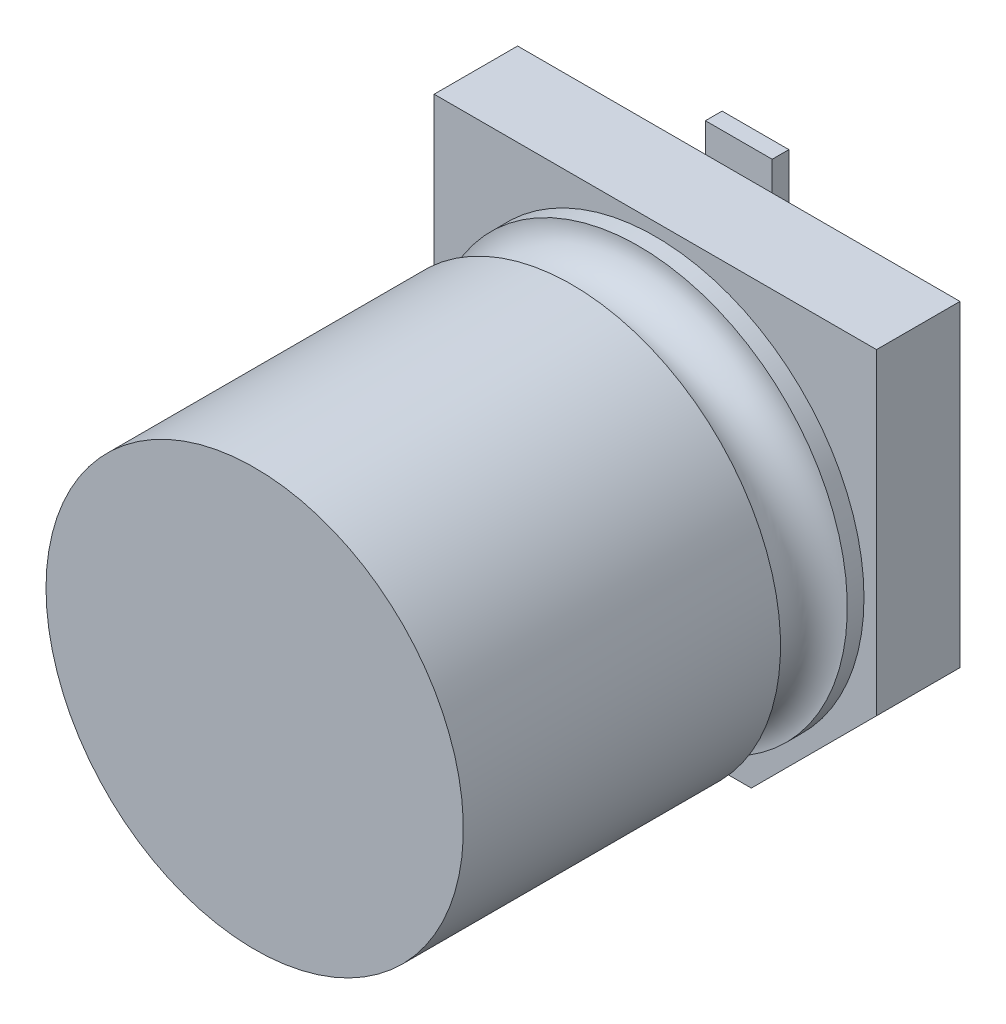
ISO-10303-21;
HEADER;
FILE_DESCRIPTION(('STEP AP214'),'2;1');
FILE_NAME('part.step','',(''),(''),'','','');
FILE_SCHEMA(('AUTOMOTIVE_DESIGN { 1 0 10303 214 1 1 1 1 }'));
ENDSEC;
DATA;
#1=APPLICATION_CONTEXT('core data for automotive mechanical design processes');
#2=APPLICATION_PROTOCOL_DEFINITION('international standard','automotive_design',2000,#1);
#3=PRODUCT_CONTEXT('',#1,'mechanical');
#4=PRODUCT('Part','Part','',(#3));
#5=PRODUCT_RELATED_PRODUCT_CATEGORY('part','',(#4));
#6=PRODUCT_DEFINITION_FORMATION('','',#4);
#7=PRODUCT_DEFINITION_CONTEXT('part definition',#1,'design');
#8=PRODUCT_DEFINITION('design','',#6,#7);
#9=PRODUCT_DEFINITION_SHAPE('','',#8);
#10=(LENGTH_UNIT() NAMED_UNIT(*) SI_UNIT(.MILLI.,.METRE.));
#11=(NAMED_UNIT(*) PLANE_ANGLE_UNIT() SI_UNIT($,.RADIAN.));
#12=(NAMED_UNIT(*) SI_UNIT($,.STERADIAN.) SOLID_ANGLE_UNIT());
#13=UNCERTAINTY_MEASURE_WITH_UNIT(LENGTH_MEASURE(1.E-05),#10,'distance_accuracy_value','');
#14=(GEOMETRIC_REPRESENTATION_CONTEXT(3) GLOBAL_UNCERTAINTY_ASSIGNED_CONTEXT((#13)) GLOBAL_UNIT_ASSIGNED_CONTEXT((#10,
#11,#12)) REPRESENTATION_CONTEXT('',''));
#15=CARTESIAN_POINT('',(0.,0.,0.));
#16=DIRECTION('',(0.,0.,1.));
#17=DIRECTION('',(1.,0.,0.));
#18=AXIS2_PLACEMENT_3D('',#15,#16,#17);
#19=CARTESIAN_POINT('',(-2.65,2.65,1.2));
#20=DIRECTION('',(1.,0.,0.));
#21=DIRECTION('',(0.,1.,0.));
#22=AXIS2_PLACEMENT_3D('',#19,#20,#21);
#23=PLANE('',#22);
#24=DIRECTION('',(0.,-1.,0.));
#25=VECTOR('',#24,1.);
#26=CARTESIAN_POINT('',(-2.65,2.65,0.2));
#27=LINE('',#26,#25);
#28=CARTESIAN_POINT('',(-2.65,2.65,0.2));
#29=VERTEX_POINT('',#28);
#30=CARTESIAN_POINT('',(-2.65,-1.15,0.2));
#31=VERTEX_POINT('',#30);
#32=EDGE_CURVE('E228',#29,#31,#27,.T.);
#33=ORIENTED_EDGE('',*,*,#32,.T.);
#34=DIRECTION('',(0.,0.,-1.));
#35=VECTOR('',#34,1.);
#36=CARTESIAN_POINT('',(-2.65,-1.15,1.2));
#37=LINE('',#36,#35);
#38=CARTESIAN_POINT('',(-2.65,-1.15,1.2));
#39=VERTEX_POINT('',#38);
#40=EDGE_CURVE('E274',#39,#31,#37,.T.);
#41=ORIENTED_EDGE('',*,*,#40,.F.);
#42=DIRECTION('',(0.,-1.,0.));
#43=VECTOR('',#42,1.);
#44=CARTESIAN_POINT('',(-2.65,2.65,1.2));
#45=LINE('',#44,#43);
#46=CARTESIAN_POINT('',(-2.65,2.65,1.2));
#47=VERTEX_POINT('',#46);
#48=EDGE_CURVE('E229',#47,#39,#45,.T.);
#49=ORIENTED_EDGE('',*,*,#48,.F.);
#50=DIRECTION('',(0.,0.,-1.));
#51=VECTOR('',#50,1.);
#52=CARTESIAN_POINT('',(-2.65,2.65,1.2));
#53=LINE('',#52,#51);
#54=EDGE_CURVE('E243',#47,#29,#53,.T.);
#55=ORIENTED_EDGE('',*,*,#54,.T.);
#56=EDGE_LOOP('',(#33,#41,#49,#55));
#57=FACE_BOUND('',#56,.T.);
#58=ADVANCED_FACE('F37',(#57),#23,.F.);
#59=CARTESIAN_POINT('',(-2.65,-1.15,1.2));
#60=DIRECTION('',(0.707106781186547,0.707106781186548,0.));
#61=DIRECTION('',(-0.707106781186548,0.707106781186547,0.));
#62=AXIS2_PLACEMENT_3D('',#59,#60,#61);
#63=PLANE('',#62);
#64=DIRECTION('',(0.707106781186548,-0.707106781186547,0.));
#65=VECTOR('',#64,1.);
#66=CARTESIAN_POINT('',(-2.65,-1.15,0.2));
#67=LINE('',#66,#65);
#68=CARTESIAN_POINT('',(-1.15,-2.65,0.2));
#69=VERTEX_POINT('',#68);
#70=EDGE_CURVE('E246',#31,#69,#67,.T.);
#71=ORIENTED_EDGE('',*,*,#70,.T.);
#72=DIRECTION('',(0.,0.,-1.));
#73=VECTOR('',#72,1.);
#74=CARTESIAN_POINT('',(-1.15,-2.65,1.2));
#75=LINE('',#74,#73);
#76=CARTESIAN_POINT('',(-1.15,-2.65,1.2));
#77=VERTEX_POINT('',#76);
#78=EDGE_CURVE('E271',#77,#69,#75,.T.);
#79=ORIENTED_EDGE('',*,*,#78,.F.);
#80=DIRECTION('',(0.707106781186548,-0.707106781186547,0.));
#81=VECTOR('',#80,1.);
#82=CARTESIAN_POINT('',(-2.65,-1.15,1.2));
#83=LINE('',#82,#81);
#84=EDGE_CURVE('E232',#39,#77,#83,.T.);
#85=ORIENTED_EDGE('',*,*,#84,.F.);
#86=ORIENTED_EDGE('',*,*,#40,.T.);
#87=EDGE_LOOP('',(#71,#79,#85,#86));
#88=FACE_BOUND('',#87,.T.);
#89=ADVANCED_FACE('F313',(#88),#63,.F.);
#90=CARTESIAN_POINT('',(-1.15,-2.65,1.2));
#91=DIRECTION('',(0.,1.,0.));
#92=DIRECTION('',(-1.,0.,0.));
#93=AXIS2_PLACEMENT_3D('',#90,#91,#92);
#94=PLANE('',#93);
#95=DIRECTION('',(1.,0.,0.));
#96=VECTOR('',#95,1.);
#97=CARTESIAN_POINT('',(-1.15,-2.65,0.2));
#98=LINE('',#97,#96);
#99=CARTESIAN_POINT('',(-0.4,-2.65,0.2));
#100=VERTEX_POINT('',#99);
#101=EDGE_CURVE('E249',#69,#100,#98,.T.);
#102=ORIENTED_EDGE('',*,*,#101,.T.);
#103=CARTESIAN_POINT('',(0.4,-2.65,0.2));
#104=VERTEX_POINT('',#103);
#105=EDGE_CURVE('E253',#100,#104,#98,.T.);
#106=ORIENTED_EDGE('',*,*,#105,.T.);
#107=CARTESIAN_POINT('',(1.15,-2.65,0.2));
#108=VERTEX_POINT('',#107);
#109=EDGE_CURVE('E248',#104,#108,#98,.T.);
#110=ORIENTED_EDGE('',*,*,#109,.T.);
#111=DIRECTION('',(0.,0.,-1.));
#112=VECTOR('',#111,1.);
#113=CARTESIAN_POINT('',(1.15,-2.65,1.2));
#114=LINE('',#113,#112);
#115=CARTESIAN_POINT('',(1.15,-2.65,1.2));
#116=VERTEX_POINT('',#115);
#117=EDGE_CURVE('E268',#116,#108,#114,.T.);
#118=ORIENTED_EDGE('',*,*,#117,.F.);
#119=DIRECTION('',(1.,0.,0.));
#120=VECTOR('',#119,1.);
#121=CARTESIAN_POINT('',(-1.15,-2.65,1.2));
#122=LINE('',#121,#120);
#123=EDGE_CURVE('E235',#77,#116,#122,.T.);
#124=ORIENTED_EDGE('',*,*,#123,.F.);
#125=ORIENTED_EDGE('',*,*,#78,.T.);
#126=EDGE_LOOP('',(#102,#106,#110,#118,#124,#125));
#127=FACE_BOUND('',#126,.T.);
#128=ADVANCED_FACE('F308',(#127),#94,.F.);
#129=CARTESIAN_POINT('',(1.15,-2.65,1.2));
#130=DIRECTION('',(-0.707106781186547,0.707106781186548,0.));
#131=DIRECTION('',(-0.707106781186548,-0.707106781186547,0.));
#132=AXIS2_PLACEMENT_3D('',#129,#130,#131);
#133=PLANE('',#132);
#134=DIRECTION('',(0.707106781186548,0.707106781186547,0.));
#135=VECTOR('',#134,1.);
#136=CARTESIAN_POINT('',(1.15,-2.65,0.2));
#137=LINE('',#136,#135);
#138=CARTESIAN_POINT('',(2.65,-1.15,0.2));
#139=VERTEX_POINT('',#138);
#140=EDGE_CURVE('E252',#108,#139,#137,.T.);
#141=ORIENTED_EDGE('',*,*,#140,.T.);
#142=DIRECTION('',(0.,0.,-1.));
#143=VECTOR('',#142,1.);
#144=CARTESIAN_POINT('',(2.65,-1.15,1.2));
#145=LINE('',#144,#143);
#146=CARTESIAN_POINT('',(2.65,-1.15,1.2));
#147=VERTEX_POINT('',#146);
#148=EDGE_CURVE('E265',#147,#139,#145,.T.);
#149=ORIENTED_EDGE('',*,*,#148,.F.);
#150=DIRECTION('',(0.707106781186548,0.707106781186547,0.));
#151=VECTOR('',#150,1.);
#152=CARTESIAN_POINT('',(1.15,-2.65,1.2));
#153=LINE('',#152,#151);
#154=EDGE_CURVE('E237',#116,#147,#153,.T.);
#155=ORIENTED_EDGE('',*,*,#154,.F.);
#156=ORIENTED_EDGE('',*,*,#117,.T.);
#157=EDGE_LOOP('',(#141,#149,#155,#156));
#158=FACE_BOUND('',#157,.T.);
#159=ADVANCED_FACE('F352',(#158),#133,.F.);
#160=CARTESIAN_POINT('',(2.65,-1.15,1.2));
#161=DIRECTION('',(-1.,0.,0.));
#162=DIRECTION('',(0.,-1.,0.));
#163=AXIS2_PLACEMENT_3D('',#160,#161,#162);
#164=PLANE('',#163);
#165=DIRECTION('',(0.,1.,0.));
#166=VECTOR('',#165,1.);
#167=CARTESIAN_POINT('',(2.65,-1.15,0.2));
#168=LINE('',#167,#166);
#169=CARTESIAN_POINT('',(2.65,2.65,0.2));
#170=VERTEX_POINT('',#169);
#171=EDGE_CURVE('E255',#139,#170,#168,.T.);
#172=ORIENTED_EDGE('',*,*,#171,.T.);
#173=DIRECTION('',(0.,0.,-1.));
#174=VECTOR('',#173,1.);
#175=CARTESIAN_POINT('',(2.65,2.65,1.2));
#176=LINE('',#175,#174);
#177=CARTESIAN_POINT('',(2.65,2.65,1.2));
#178=VERTEX_POINT('',#177);
#179=EDGE_CURVE('E262',#178,#170,#176,.T.);
#180=ORIENTED_EDGE('',*,*,#179,.F.);
#181=DIRECTION('',(0.,1.,0.));
#182=VECTOR('',#181,1.);
#183=CARTESIAN_POINT('',(2.65,-1.15,1.2));
#184=LINE('',#183,#182);
#185=EDGE_CURVE('E239',#147,#178,#184,.T.);
#186=ORIENTED_EDGE('',*,*,#185,.F.);
#187=ORIENTED_EDGE('',*,*,#148,.T.);
#188=EDGE_LOOP('',(#172,#180,#186,#187));
#189=FACE_BOUND('',#188,.T.);
#190=ADVANCED_FACE('F357',(#189),#164,.F.);
#191=CARTESIAN_POINT('',(-2.65,2.65,1.2));
#192=DIRECTION('',(0.,-1.,0.));
#193=DIRECTION('',(1.,0.,0.));
#194=AXIS2_PLACEMENT_3D('',#191,#192,#193);
#195=PLANE('',#194);
#196=DIRECTION('',(-1.,0.,0.));
#197=VECTOR('',#196,1.);
#198=CARTESIAN_POINT('',(-2.65,2.65,0.2));
#199=LINE('',#198,#197);
#200=CARTESIAN_POINT('',(0.4,2.65,0.2));
#201=VERTEX_POINT('',#200);
#202=EDGE_CURVE('E233',#170,#201,#199,.T.);
#203=ORIENTED_EDGE('',*,*,#202,.T.);
#204=CARTESIAN_POINT('',(-0.4,2.65,0.2));
#205=VERTEX_POINT('',#204);
#206=EDGE_CURVE('E157',#201,#205,#199,.T.);
#207=ORIENTED_EDGE('',*,*,#206,.T.);
#208=EDGE_CURVE('E257',#205,#29,#199,.T.);
#209=ORIENTED_EDGE('',*,*,#208,.T.);
#210=ORIENTED_EDGE('',*,*,#54,.F.);
#211=DIRECTION('',(-1.,0.,0.));
#212=VECTOR('',#211,1.);
#213=CARTESIAN_POINT('',(-2.65,2.65,1.2));
#214=LINE('',#213,#212);
#215=EDGE_CURVE('E241',#178,#47,#214,.T.);
#216=ORIENTED_EDGE('',*,*,#215,.F.);
#217=ORIENTED_EDGE('',*,*,#179,.T.);
#218=EDGE_LOOP('',(#203,#207,#209,#210,#216,#217));
#219=FACE_BOUND('',#218,.T.);
#220=ADVANCED_FACE('F323',(#219),#195,.F.);
#221=CARTESIAN_POINT('',(0.,0.,1.2));
#222=DIRECTION('',(0.,0.,1.));
#223=DIRECTION('',(1.,0.,0.));
#224=AXIS2_PLACEMENT_3D('',#221,#222,#223);
#225=PLANE('',#224);
#226=CARTESIAN_POINT('',(0.,0.,1.2));
#227=DIRECTION('',(0.,0.,1.));
#228=DIRECTION('',(1.,0.,0.));
#229=AXIS2_PLACEMENT_3D('',#226,#227,#228);
#230=CIRCLE('',#229,2.5);
#231=CARTESIAN_POINT('',(2.5,0.,1.2));
#232=VERTEX_POINT('',#231);
#233=EDGE_CURVE('E276',#232,#232,#230,.T.);
#234=ORIENTED_EDGE('',*,*,#233,.F.);
#235=EDGE_LOOP('',(#234));
#236=FACE_BOUND('',#235,.T.);
#237=ORIENTED_EDGE('',*,*,#48,.T.);
#238=ORIENTED_EDGE('',*,*,#84,.T.);
#239=ORIENTED_EDGE('',*,*,#123,.T.);
#240=ORIENTED_EDGE('',*,*,#154,.T.);
#241=ORIENTED_EDGE('',*,*,#185,.T.);
#242=ORIENTED_EDGE('',*,*,#215,.T.);
#243=EDGE_LOOP('',(#237,#238,#239,#240,#241,#242));
#244=FACE_BOUND('',#243,.T.);
#245=ADVANCED_FACE('F364',(#236,#244),#225,.T.);
#246=CARTESIAN_POINT('',(0.,0.,0.2));
#247=DIRECTION('',(0.,0.,1.));
#248=DIRECTION('',(1.,0.,0.));
#249=AXIS2_PLACEMENT_3D('',#246,#247,#248);
#250=PLANE('',#249);
#251=CARTESIAN_POINT('',(0.,1.1,0.2));
#252=DIRECTION('',(0.,0.,1.));
#253=DIRECTION('',(1.,0.,0.));
#254=AXIS2_PLACEMENT_3D('',#251,#252,#253);
#255=CIRCLE('',#254,0.4);
#256=CARTESIAN_POINT('',(0.4,1.1,0.2));
#257=VERTEX_POINT('',#256);
#258=CARTESIAN_POINT('',(-0.4,1.1,0.2));
#259=VERTEX_POINT('',#258);
#260=EDGE_CURVE('E51',#257,#259,#255,.F.);
#261=ORIENTED_EDGE('',*,*,#260,.F.);
#262=DIRECTION('',(0.,1.,0.));
#263=VECTOR('',#262,1.);
#264=CARTESIAN_POINT('',(0.4,0.,0.2));
#265=LINE('',#264,#263);
#266=EDGE_CURVE('E11',#257,#201,#265,.T.);
#267=ORIENTED_EDGE('',*,*,#266,.T.);
#268=ORIENTED_EDGE('',*,*,#202,.F.);
#269=ORIENTED_EDGE('',*,*,#171,.F.);
#270=ORIENTED_EDGE('',*,*,#140,.F.);
#271=ORIENTED_EDGE('',*,*,#109,.F.);
#272=DIRECTION('',(0.,1.,0.));
#273=VECTOR('',#272,1.);
#274=CARTESIAN_POINT('',(0.4,-1.1,0.2));
#275=LINE('',#274,#273);
#276=CARTESIAN_POINT('',(0.4,-1.1,0.2));
#277=VERTEX_POINT('',#276);
#278=EDGE_CURVE('E44',#104,#277,#275,.T.);
#279=ORIENTED_EDGE('',*,*,#278,.T.);
#280=CARTESIAN_POINT('',(0.,-1.1,0.2));
#281=DIRECTION('',(0.,0.,1.));
#282=DIRECTION('',(1.,0.,0.));
#283=AXIS2_PLACEMENT_3D('',#280,#281,#282);
#284=CIRCLE('',#283,0.4);
#285=CARTESIAN_POINT('',(-0.4,-1.1,0.2));
#286=VERTEX_POINT('',#285);
#287=EDGE_CURVE('E59',#277,#286,#284,.T.);
#288=ORIENTED_EDGE('',*,*,#287,.T.);
#289=DIRECTION('',(0.,-1.,0.));
#290=VECTOR('',#289,1.);
#291=CARTESIAN_POINT('',(-0.4,-1.1,0.2));
#292=LINE('',#291,#290);
#293=EDGE_CURVE('E211',#286,#100,#292,.T.);
#294=ORIENTED_EDGE('',*,*,#293,.T.);
#295=ORIENTED_EDGE('',*,*,#101,.F.);
#296=ORIENTED_EDGE('',*,*,#70,.F.);
#297=ORIENTED_EDGE('',*,*,#32,.F.);
#298=ORIENTED_EDGE('',*,*,#208,.F.);
#299=DIRECTION('',(0.,1.,0.));
#300=VECTOR('',#299,1.);
#301=CARTESIAN_POINT('',(-0.4,1.1,0.2));
#302=LINE('',#301,#300);
#303=EDGE_CURVE('E179',#259,#205,#302,.T.);
#304=ORIENTED_EDGE('',*,*,#303,.F.);
#305=EDGE_LOOP('',(#261,#267,#268,#269,#270,#271,#279,#288,#294,#295,#296,#297,#298,#304));
#306=FACE_BOUND('',#305,.T.);
#307=ADVANCED_FACE('F283',(#306),#250,.F.);
#308=CARTESIAN_POINT('',(0.,0.,0.));
#309=DIRECTION('',(0.,0.,-1.));
#310=DIRECTION('',(-1.,0.,0.));
#311=AXIS2_PLACEMENT_3D('',#308,#309,#310);
#312=CYLINDRICAL_SURFACE('',#311,2.5);
#313=CARTESIAN_POINT('',(0.,0.,1.4));
#314=DIRECTION('',(0.,0.,-1.));
#315=DIRECTION('',(-1.,0.,0.));
#316=AXIS2_PLACEMENT_3D('',#313,#314,#315);
#317=CIRCLE('',#316,2.5);
#318=CARTESIAN_POINT('',(-2.5,0.,1.4));
#319=VERTEX_POINT('',#318);
#320=EDGE_CURVE('E225',#319,#319,#317,.T.);
#321=ORIENTED_EDGE('',*,*,#320,.T.);
#322=EDGE_LOOP('',(#321));
#323=FACE_BOUND('',#322,.T.);
#324=ORIENTED_EDGE('',*,*,#233,.T.);
#325=EDGE_LOOP('',(#324));
#326=FACE_BOUND('',#325,.T.);
#327=ADVANCED_FACE('F367',(#323,#326),#312,.T.);
#328=CARTESIAN_POINT('',(0.,0.,1.8));
#329=DIRECTION('',(0.,0.,-1.));
#330=DIRECTION('',(-1.,0.,0.));
#331=AXIS2_PLACEMENT_3D('',#328,#329,#330);
#332=TOROIDAL_SURFACE('',#331,2.5,0.4);
#333=CARTESIAN_POINT('',(0.,0.,2.2));
#334=DIRECTION('',(0.,0.,-1.));
#335=DIRECTION('',(-1.,0.,0.));
#336=AXIS2_PLACEMENT_3D('',#333,#334,#335);
#337=CIRCLE('',#336,2.5);
#338=CARTESIAN_POINT('',(-2.5,0.,2.2));
#339=VERTEX_POINT('',#338);
#340=EDGE_CURVE('E222',#339,#339,#337,.T.);
#341=ORIENTED_EDGE('',*,*,#340,.T.);
#342=EDGE_LOOP('',(#341));
#343=FACE_BOUND('',#342,.T.);
#344=ORIENTED_EDGE('',*,*,#320,.F.);
#345=EDGE_LOOP('',(#344));
#346=FACE_BOUND('',#345,.T.);
#347=ADVANCED_FACE('F373',(#343,#346),#332,.F.);
#348=CARTESIAN_POINT('',(0.,0.,0.));
#349=DIRECTION('',(0.,0.,-1.));
#350=DIRECTION('',(-1.,0.,0.));
#351=AXIS2_PLACEMENT_3D('',#348,#349,#350);
#352=CYLINDRICAL_SURFACE('',#351,2.5);
#353=CARTESIAN_POINT('',(0.,0.,6.));
#354=DIRECTION('',(0.,0.,-1.));
#355=DIRECTION('',(-1.,0.,0.));
#356=AXIS2_PLACEMENT_3D('',#353,#354,#355);
#357=CIRCLE('',#356,2.5);
#358=CARTESIAN_POINT('',(-2.5,0.,6.));
#359=VERTEX_POINT('',#358);
#360=EDGE_CURVE('E207',#359,#359,#357,.T.);
#361=ORIENTED_EDGE('',*,*,#360,.T.);
#362=EDGE_LOOP('',(#361));
#363=FACE_BOUND('',#362,.T.);
#364=ORIENTED_EDGE('',*,*,#340,.F.);
#365=EDGE_LOOP('',(#364));
#366=FACE_BOUND('',#365,.T.);
#367=ADVANCED_FACE('F377',(#363,#366),#352,.T.);
#368=CARTESIAN_POINT('',(0.,0.,6.));
#369=DIRECTION('',(0.,0.,1.));
#370=DIRECTION('',(1.,0.,0.));
#371=AXIS2_PLACEMENT_3D('',#368,#369,#370);
#372=PLANE('',#371);
#373=ORIENTED_EDGE('',*,*,#360,.F.);
#374=EDGE_LOOP('',(#373));
#375=FACE_BOUND('',#374,.T.);
#376=ADVANCED_FACE('F381',(#375),#372,.T.);
#377=CARTESIAN_POINT('',(0.,0.,0.2));
#378=DIRECTION('',(0.,0.,1.));
#379=DIRECTION('',(1.,0.,0.));
#380=AXIS2_PLACEMENT_3D('',#377,#378,#379);
#381=PLANE('',#380);
#382=ORIENTED_EDGE('',*,*,#105,.F.);
#383=CARTESIAN_POINT('',(-0.4,-3.,0.2));
#384=VERTEX_POINT('',#383);
#385=EDGE_CURVE('E214',#100,#384,#292,.T.);
#386=ORIENTED_EDGE('',*,*,#385,.T.);
#387=DIRECTION('',(1.,0.,0.));
#388=VECTOR('',#387,1.);
#389=CARTESIAN_POINT('',(0.4,-3.,0.2));
#390=LINE('',#389,#388);
#391=CARTESIAN_POINT('',(0.4,-3.,0.2));
#392=VERTEX_POINT('',#391);
#393=EDGE_CURVE('E208',#384,#392,#390,.T.);
#394=ORIENTED_EDGE('',*,*,#393,.T.);
#395=EDGE_CURVE('E204',#392,#104,#275,.T.);
#396=ORIENTED_EDGE('',*,*,#395,.T.);
#397=EDGE_LOOP('',(#382,#386,#394,#396));
#398=FACE_BOUND('',#397,.T.);
#399=ADVANCED_FACE('F290',(#398),#381,.T.);
#400=CARTESIAN_POINT('',(-0.4,-1.1,2.63515913237718));
#401=DIRECTION('',(1.,0.,0.));
#402=DIRECTION('',(0.,1.,0.));
#403=AXIS2_PLACEMENT_3D('',#400,#401,#402);
#404=PLANE('',#403);
#405=ORIENTED_EDGE('',*,*,#293,.F.);
#406=DIRECTION('',(0.,0.,-1.));
#407=VECTOR('',#406,1.);
#408=CARTESIAN_POINT('',(-0.4,-1.1,2.63515913237718));
#409=LINE('',#408,#407);
#410=CARTESIAN_POINT('',(-0.4,-1.1,0.));
#411=VERTEX_POINT('',#410);
#412=EDGE_CURVE('E188',#286,#411,#409,.T.);
#413=ORIENTED_EDGE('',*,*,#412,.T.);
#414=DIRECTION('',(0.,-1.,0.));
#415=VECTOR('',#414,1.);
#416=CARTESIAN_POINT('',(-0.4,-1.1,0.));
#417=LINE('',#416,#415);
#418=CARTESIAN_POINT('',(-0.4,-3.,0.));
#419=VERTEX_POINT('',#418);
#420=EDGE_CURVE('E201',#411,#419,#417,.T.);
#421=ORIENTED_EDGE('',*,*,#420,.T.);
#422=DIRECTION('',(0.,0.,-1.));
#423=VECTOR('',#422,1.);
#424=CARTESIAN_POINT('',(-0.4,-3.,2.63515913237718));
#425=LINE('',#424,#423);
#426=EDGE_CURVE('E200',#384,#419,#425,.T.);
#427=ORIENTED_EDGE('',*,*,#426,.F.);
#428=ORIENTED_EDGE('',*,*,#385,.F.);
#429=EDGE_LOOP('',(#405,#413,#421,#427,#428));
#430=FACE_BOUND('',#429,.T.);
#431=ADVANCED_FACE('F299',(#430),#404,.F.);
#432=CARTESIAN_POINT('',(0.4,-3.,2.63515913237718));
#433=DIRECTION('',(0.,1.,0.));
#434=DIRECTION('',(0.,0.,1.));
#435=AXIS2_PLACEMENT_3D('',#432,#433,#434);
#436=PLANE('',#435);
#437=ORIENTED_EDGE('',*,*,#393,.F.);
#438=ORIENTED_EDGE('',*,*,#426,.T.);
#439=DIRECTION('',(1.,0.,0.));
#440=VECTOR('',#439,1.);
#441=CARTESIAN_POINT('',(0.4,-3.,0.));
#442=LINE('',#441,#440);
#443=CARTESIAN_POINT('',(0.4,-3.,0.));
#444=VERTEX_POINT('',#443);
#445=EDGE_CURVE('E197',#419,#444,#442,.T.);
#446=ORIENTED_EDGE('',*,*,#445,.T.);
#447=DIRECTION('',(0.,0.,-1.));
#448=VECTOR('',#447,1.);
#449=CARTESIAN_POINT('',(0.4,-3.,2.63515913237718));
#450=LINE('',#449,#448);
#451=EDGE_CURVE('E196',#392,#444,#450,.T.);
#452=ORIENTED_EDGE('',*,*,#451,.F.);
#453=EDGE_LOOP('',(#437,#438,#446,#452));
#454=FACE_BOUND('',#453,.T.);
#455=ADVANCED_FACE('F295',(#454),#436,.F.);
#456=CARTESIAN_POINT('',(0.4,-1.1,2.63515913237718));
#457=DIRECTION('',(-1.,0.,0.));
#458=DIRECTION('',(0.,-1.,0.));
#459=AXIS2_PLACEMENT_3D('',#456,#457,#458);
#460=PLANE('',#459);
#461=ORIENTED_EDGE('',*,*,#395,.F.);
#462=ORIENTED_EDGE('',*,*,#451,.T.);
#463=DIRECTION('',(0.,1.,0.));
#464=VECTOR('',#463,1.);
#465=CARTESIAN_POINT('',(0.4,-1.1,0.));
#466=LINE('',#465,#464);
#467=CARTESIAN_POINT('',(0.4,-1.1,0.));
#468=VERTEX_POINT('',#467);
#469=EDGE_CURVE('E193',#444,#468,#466,.T.);
#470=ORIENTED_EDGE('',*,*,#469,.T.);
#471=DIRECTION('',(0.,0.,-1.));
#472=VECTOR('',#471,1.);
#473=CARTESIAN_POINT('',(0.4,-1.1,2.63515913237718));
#474=LINE('',#473,#472);
#475=EDGE_CURVE('E192',#277,#468,#474,.T.);
#476=ORIENTED_EDGE('',*,*,#475,.F.);
#477=ORIENTED_EDGE('',*,*,#278,.F.);
#478=EDGE_LOOP('',(#461,#462,#470,#476,#477));
#479=FACE_BOUND('',#478,.T.);
#480=ADVANCED_FACE('F287',(#479),#460,.F.);
#481=CARTESIAN_POINT('',(0.,-1.1,2.63515913237718));
#482=DIRECTION('',(0.,0.,-1.));
#483=DIRECTION('',(-1.,0.,0.));
#484=AXIS2_PLACEMENT_3D('',#481,#482,#483);
#485=CYLINDRICAL_SURFACE('',#484,0.4);
#486=ORIENTED_EDGE('',*,*,#287,.F.);
#487=ORIENTED_EDGE('',*,*,#475,.T.);
#488=CARTESIAN_POINT('',(0.,-1.1,0.));
#489=DIRECTION('',(0.,0.,1.));
#490=DIRECTION('',(1.,0.,0.));
#491=AXIS2_PLACEMENT_3D('',#488,#489,#490);
#492=CIRCLE('',#491,0.4);
#493=EDGE_CURVE('E189',#468,#411,#492,.T.);
#494=ORIENTED_EDGE('',*,*,#493,.T.);
#495=ORIENTED_EDGE('',*,*,#412,.F.);
#496=EDGE_LOOP('',(#486,#487,#494,#495));
#497=FACE_BOUND('',#496,.T.);
#498=ADVANCED_FACE('F305',(#497),#485,.T.);
#499=CARTESIAN_POINT('',(0.,-1.1,0.));
#500=DIRECTION('',(0.,0.,1.));
#501=DIRECTION('',(1.,0.,0.));
#502=AXIS2_PLACEMENT_3D('',#499,#500,#501);
#503=PLANE('',#502);
#504=ORIENTED_EDGE('',*,*,#420,.F.);
#505=ORIENTED_EDGE('',*,*,#493,.F.);
#506=ORIENTED_EDGE('',*,*,#469,.F.);
#507=ORIENTED_EDGE('',*,*,#445,.F.);
#508=EDGE_LOOP('',(#504,#505,#506,#507));
#509=FACE_BOUND('',#508,.T.);
#510=ADVANCED_FACE('F303',(#509),#503,.F.);
#511=CARTESIAN_POINT('',(0.,0.,0.2));
#512=DIRECTION('',(0.,0.,1.));
#513=DIRECTION('',(1.,0.,0.));
#514=AXIS2_PLACEMENT_3D('',#511,#512,#513);
#515=PLANE('',#514);
#516=ORIENTED_EDGE('',*,*,#206,.F.);
#517=DIRECTION('',(0.,-1.,0.));
#518=VECTOR('',#517,1.);
#519=CARTESIAN_POINT('',(0.4,1.1,0.2));
#520=LINE('',#519,#518);
#521=CARTESIAN_POINT('',(0.4,3.,0.2));
#522=VERTEX_POINT('',#521);
#523=EDGE_CURVE('E150',#522,#201,#520,.T.);
#524=ORIENTED_EDGE('',*,*,#523,.F.);
#525=DIRECTION('',(1.,0.,0.));
#526=VECTOR('',#525,1.);
#527=CARTESIAN_POINT('',(0.4,3.,0.2));
#528=LINE('',#527,#526);
#529=CARTESIAN_POINT('',(-0.4,3.,0.2));
#530=VERTEX_POINT('',#529);
#531=EDGE_CURVE('E154',#530,#522,#528,.T.);
#532=ORIENTED_EDGE('',*,*,#531,.F.);
#533=EDGE_CURVE('E182',#205,#530,#302,.T.);
#534=ORIENTED_EDGE('',*,*,#533,.F.);
#535=EDGE_LOOP('',(#516,#524,#532,#534));
#536=FACE_BOUND('',#535,.T.);
#537=ADVANCED_FACE('F152',(#536),#515,.T.);
#538=CARTESIAN_POINT('',(0.,1.1,0.));
#539=DIRECTION('',(0.,0.,1.));
#540=DIRECTION('',(1.,0.,0.));
#541=AXIS2_PLACEMENT_3D('',#538,#539,#540);
#542=PLANE('',#541);
#543=DIRECTION('',(0.,1.,0.));
#544=VECTOR('',#543,1.);
#545=CARTESIAN_POINT('',(-0.4,1.1,0.));
#546=LINE('',#545,#544);
#547=CARTESIAN_POINT('',(-0.4,1.1,0.));
#548=VERTEX_POINT('',#547);
#549=CARTESIAN_POINT('',(-0.4,3.,0.));
#550=VERTEX_POINT('',#549);
#551=EDGE_CURVE('E178',#548,#550,#546,.T.);
#552=ORIENTED_EDGE('',*,*,#551,.T.);
#553=DIRECTION('',(1.,0.,0.));
#554=VECTOR('',#553,1.);
#555=CARTESIAN_POINT('',(0.4,3.,0.));
#556=LINE('',#555,#554);
#557=CARTESIAN_POINT('',(0.4,3.,0.));
#558=VERTEX_POINT('',#557);
#559=EDGE_CURVE('E333',#550,#558,#556,.T.);
#560=ORIENTED_EDGE('',*,*,#559,.T.);
#561=DIRECTION('',(0.,-1.,0.));
#562=VECTOR('',#561,1.);
#563=CARTESIAN_POINT('',(0.4,1.1,0.));
#564=LINE('',#563,#562);
#565=CARTESIAN_POINT('',(0.4,1.1,0.));
#566=VERTEX_POINT('',#565);
#567=EDGE_CURVE('E165',#558,#566,#564,.T.);
#568=ORIENTED_EDGE('',*,*,#567,.T.);
#569=CARTESIAN_POINT('',(0.,1.1,0.));
#570=DIRECTION('',(0.,0.,-1.));
#571=DIRECTION('',(1.,0.,0.));
#572=AXIS2_PLACEMENT_3D('',#569,#570,#571);
#573=CIRCLE('',#572,0.4);
#574=EDGE_CURVE('E172',#566,#548,#573,.T.);
#575=ORIENTED_EDGE('',*,*,#574,.T.);
#576=EDGE_LOOP('',(#552,#560,#568,#575));
#577=FACE_BOUND('',#576,.T.);
#578=ADVANCED_FACE('F332',(#577),#542,.F.);
#579=CARTESIAN_POINT('',(0.4,3.,2.63515913237718));
#580=DIRECTION('',(0.,1.,0.));
#581=DIRECTION('',(0.,0.,1.));
#582=AXIS2_PLACEMENT_3D('',#579,#580,#581);
#583=PLANE('',#582);
#584=DIRECTION('',(0.,0.,-1.));
#585=VECTOR('',#584,1.);
#586=CARTESIAN_POINT('',(-0.4,3.,2.63515913237718));
#587=LINE('',#586,#585);
#588=EDGE_CURVE('E171',#530,#550,#587,.T.);
#589=ORIENTED_EDGE('',*,*,#588,.F.);
#590=ORIENTED_EDGE('',*,*,#531,.T.);
#591=DIRECTION('',(0.,0.,-1.));
#592=VECTOR('',#591,1.);
#593=CARTESIAN_POINT('',(0.4,3.,2.63515913237718));
#594=LINE('',#593,#592);
#595=EDGE_CURVE('E160',#522,#558,#594,.T.);
#596=ORIENTED_EDGE('',*,*,#595,.T.);
#597=ORIENTED_EDGE('',*,*,#559,.F.);
#598=EDGE_LOOP('',(#589,#590,#596,#597));
#599=FACE_BOUND('',#598,.T.);
#600=ADVANCED_FACE('F170',(#599),#583,.T.);
#601=CARTESIAN_POINT('',(0.4,1.1,2.63515913237718));
#602=DIRECTION('',(1.,0.,0.));
#603=DIRECTION('',(0.,1.,0.));
#604=AXIS2_PLACEMENT_3D('',#601,#602,#603);
#605=PLANE('',#604);
#606=ORIENTED_EDGE('',*,*,#595,.F.);
#607=ORIENTED_EDGE('',*,*,#523,.T.);
#608=ORIENTED_EDGE('',*,*,#266,.F.);
#609=DIRECTION('',(0.,0.,-1.));
#610=VECTOR('',#609,1.);
#611=CARTESIAN_POINT('',(0.4,1.1,2.63515913237718));
#612=LINE('',#611,#610);
#613=EDGE_CURVE('E159',#257,#566,#612,.T.);
#614=ORIENTED_EDGE('',*,*,#613,.T.);
#615=ORIENTED_EDGE('',*,*,#567,.F.);
#616=EDGE_LOOP('',(#606,#607,#608,#614,#615));
#617=FACE_BOUND('',#616,.T.);
#618=ADVANCED_FACE('F163',(#617),#605,.T.);
#619=CARTESIAN_POINT('',(0.,1.1,2.63515913237718));
#620=DIRECTION('',(0.,0.,-1.));
#621=DIRECTION('',(-1.,0.,0.));
#622=AXIS2_PLACEMENT_3D('',#619,#620,#621);
#623=CYLINDRICAL_SURFACE('',#622,0.4);
#624=ORIENTED_EDGE('',*,*,#613,.F.);
#625=ORIENTED_EDGE('',*,*,#260,.T.);
#626=DIRECTION('',(0.,0.,-1.));
#627=VECTOR('',#626,1.);
#628=CARTESIAN_POINT('',(-0.4,1.1,2.63515913237718));
#629=LINE('',#628,#627);
#630=EDGE_CURVE('E183',#259,#548,#629,.T.);
#631=ORIENTED_EDGE('',*,*,#630,.T.);
#632=ORIENTED_EDGE('',*,*,#574,.F.);
#633=EDGE_LOOP('',(#624,#625,#631,#632));
#634=FACE_BOUND('',#633,.T.);
#635=ADVANCED_FACE('F328',(#634),#623,.T.);
#636=CARTESIAN_POINT('',(-0.4,1.1,2.63515913237718));
#637=DIRECTION('',(-1.,0.,0.));
#638=DIRECTION('',(0.,-1.,0.));
#639=AXIS2_PLACEMENT_3D('',#636,#637,#638);
#640=PLANE('',#639);
#641=ORIENTED_EDGE('',*,*,#630,.F.);
#642=ORIENTED_EDGE('',*,*,#303,.T.);
#643=ORIENTED_EDGE('',*,*,#533,.T.);
#644=ORIENTED_EDGE('',*,*,#588,.T.);
#645=ORIENTED_EDGE('',*,*,#551,.F.);
#646=EDGE_LOOP('',(#641,#642,#643,#644,#645));
#647=FACE_BOUND('',#646,.T.);
#648=ADVANCED_FACE('F337',(#647),#640,.T.);
#649=CLOSED_SHELL('',(#58,#89,#128,#159,#190,#220,#245,#307,#327,#347,#367,#376,#399,#431,#455,
#480,#498,#510,#537,#578,#600,#618,#635,#648));
#650=MANIFOLD_SOLID_BREP('B2',#649);
#651=ADVANCED_BREP_SHAPE_REPRESENTATION('',(#18,#650),#14);
#652=SHAPE_DEFINITION_REPRESENTATION(#9,#651);
ENDSEC;
END-ISO-10303-21;
